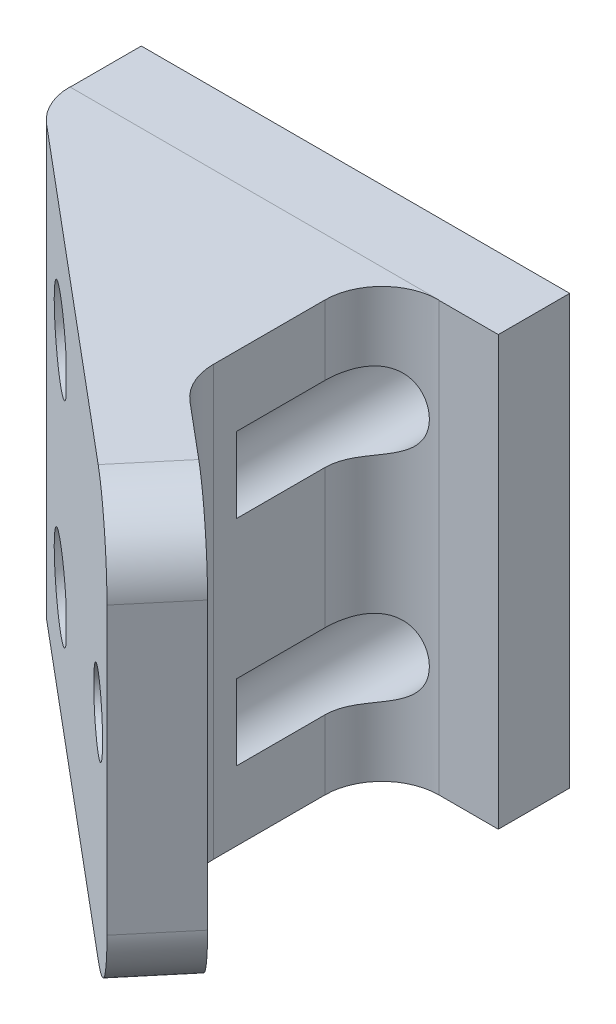
ISO-10303-21;
HEADER;
FILE_DESCRIPTION(('STEP AP214'),'2;1');
FILE_NAME('part.step','',(''),(''),'','','');
FILE_SCHEMA(('AUTOMOTIVE_DESIGN { 1 0 10303 214 1 1 1 1 }'));
ENDSEC;
DATA;
#1=APPLICATION_CONTEXT('core data for automotive mechanical design processes');
#2=APPLICATION_PROTOCOL_DEFINITION('international standard','automotive_design',2000,#1);
#3=PRODUCT_CONTEXT('',#1,'mechanical');
#4=PRODUCT('Part','Part','',(#3));
#5=PRODUCT_RELATED_PRODUCT_CATEGORY('part','',(#4));
#6=PRODUCT_DEFINITION_FORMATION('','',#4);
#7=PRODUCT_DEFINITION_CONTEXT('part definition',#1,'design');
#8=PRODUCT_DEFINITION('design','',#6,#7);
#9=PRODUCT_DEFINITION_SHAPE('','',#8);
#10=(LENGTH_UNIT() NAMED_UNIT(*) SI_UNIT(.MILLI.,.METRE.));
#11=(NAMED_UNIT(*) PLANE_ANGLE_UNIT() SI_UNIT($,.RADIAN.));
#12=(NAMED_UNIT(*) SI_UNIT($,.STERADIAN.) SOLID_ANGLE_UNIT());
#13=UNCERTAINTY_MEASURE_WITH_UNIT(LENGTH_MEASURE(1.E-05),#10,'distance_accuracy_value','');
#14=(GEOMETRIC_REPRESENTATION_CONTEXT(3) GLOBAL_UNCERTAINTY_ASSIGNED_CONTEXT((#13)) GLOBAL_UNIT_ASSIGNED_CONTEXT((#10,
#11,#12)) REPRESENTATION_CONTEXT('',''));
#15=CARTESIAN_POINT('',(0.,0.,0.));
#16=DIRECTION('',(0.,0.,1.));
#17=DIRECTION('',(1.,0.,0.));
#18=AXIS2_PLACEMENT_3D('',#15,#16,#17);
#19=CARTESIAN_POINT('',(0.,0.,3.175));
#20=DIRECTION('',(0.,0.,-1.));
#21=DIRECTION('',(-1.,0.,0.));
#22=AXIS2_PLACEMENT_3D('',#19,#20,#21);
#23=PLANE('',#22);
#24=DIRECTION('',(-1.,0.,0.));
#25=VECTOR('',#24,1.);
#26=CARTESIAN_POINT('',(-9.525,9.525,3.175));
#27=LINE('',#26,#25);
#28=CARTESIAN_POINT('',(9.525,9.525,3.175));
#29=VERTEX_POINT('',#28);
#30=CARTESIAN_POINT('',(6.88935843294051,9.525,3.175));
#31=VERTEX_POINT('',#30);
#32=EDGE_CURVE('E357',#29,#31,#27,.T.);
#33=ORIENTED_EDGE('',*,*,#32,.T.);
#34=DIRECTION('',(0.,1.,0.));
#35=VECTOR('',#34,1.);
#36=CARTESIAN_POINT('',(6.88935843294051,-9.525,3.175));
#37=LINE('',#36,#35);
#38=CARTESIAN_POINT('',(6.88935843294051,-9.525,3.175));
#39=VERTEX_POINT('',#38);
#40=EDGE_CURVE('E382',#39,#31,#37,.T.);
#41=ORIENTED_EDGE('',*,*,#40,.F.);
#42=DIRECTION('',(1.,0.,0.));
#43=VECTOR('',#42,1.);
#44=CARTESIAN_POINT('',(-9.525,-9.525,3.175));
#45=LINE('',#44,#43);
#46=CARTESIAN_POINT('',(9.525,-9.525,3.175));
#47=VERTEX_POINT('',#46);
#48=EDGE_CURVE('E335',#39,#47,#45,.T.);
#49=ORIENTED_EDGE('',*,*,#48,.T.);
#50=DIRECTION('',(0.,1.,0.));
#51=VECTOR('',#50,1.);
#52=CARTESIAN_POINT('',(9.525,-9.525,3.175));
#53=LINE('',#52,#51);
#54=EDGE_CURVE('E339',#47,#29,#53,.T.);
#55=ORIENTED_EDGE('',*,*,#54,.T.);
#56=EDGE_LOOP('',(#33,#41,#49,#55));
#57=FACE_BOUND('',#56,.T.);
#58=ADVANCED_FACE('F45',(#57),#23,.F.);
#59=CARTESIAN_POINT('',(0.,0.,0.));
#60=DIRECTION('',(0.,0.,-1.));
#61=DIRECTION('',(-1.,0.,0.));
#62=AXIS2_PLACEMENT_3D('',#59,#60,#61);
#63=PLANE('',#62);
#64=CARTESIAN_POINT('',(4.7625,-4.7625,0.));
#65=DIRECTION('',(0.,0.,1.));
#66=DIRECTION('',(1.,0.,0.));
#67=AXIS2_PLACEMENT_3D('',#64,#65,#66);
#68=CIRCLE('',#67,1.7272);
#69=CARTESIAN_POINT('',(6.4897,-4.7625,0.));
#70=VERTEX_POINT('',#69);
#71=EDGE_CURVE('E370',#70,#70,#68,.T.);
#72=ORIENTED_EDGE('',*,*,#71,.T.);
#73=EDGE_LOOP('',(#72));
#74=FACE_BOUND('',#73,.T.);
#75=CARTESIAN_POINT('',(-4.7625,4.7625,0.));
#76=DIRECTION('',(0.,0.,1.));
#77=DIRECTION('',(1.,0.,0.));
#78=AXIS2_PLACEMENT_3D('',#75,#76,#77);
#79=CIRCLE('',#78,1.7272);
#80=CARTESIAN_POINT('',(-3.0353,4.7625,0.));
#81=VERTEX_POINT('',#80);
#82=EDGE_CURVE('E350',#81,#81,#79,.T.);
#83=ORIENTED_EDGE('',*,*,#82,.T.);
#84=EDGE_LOOP('',(#83));
#85=FACE_BOUND('',#84,.T.);
#86=DIRECTION('',(0.,1.,0.));
#87=VECTOR('',#86,1.);
#88=CARTESIAN_POINT('',(9.525,-9.525,0.));
#89=LINE('',#88,#87);
#90=CARTESIAN_POINT('',(9.525,-9.525,0.));
#91=VERTEX_POINT('',#90);
#92=CARTESIAN_POINT('',(9.525,9.525,0.));
#93=VERTEX_POINT('',#92);
#94=EDGE_CURVE('E346',#91,#93,#89,.T.);
#95=ORIENTED_EDGE('',*,*,#94,.F.);
#96=DIRECTION('',(1.,0.,0.));
#97=VECTOR('',#96,1.);
#98=CARTESIAN_POINT('',(-9.525,-9.525,0.));
#99=LINE('',#98,#97);
#100=CARTESIAN_POINT('',(-9.525,-9.525,0.));
#101=VERTEX_POINT('',#100);
#102=EDGE_CURVE('E336',#101,#91,#99,.T.);
#103=ORIENTED_EDGE('',*,*,#102,.F.);
#104=DIRECTION('',(0.,-1.,0.));
#105=VECTOR('',#104,1.);
#106=CARTESIAN_POINT('',(-9.525,-9.525,0.));
#107=LINE('',#106,#105);
#108=CARTESIAN_POINT('',(-9.525,9.525,0.));
#109=VERTEX_POINT('',#108);
#110=EDGE_CURVE('E340',#109,#101,#107,.T.);
#111=ORIENTED_EDGE('',*,*,#110,.F.);
#112=DIRECTION('',(-1.,0.,0.));
#113=VECTOR('',#112,1.);
#114=CARTESIAN_POINT('',(-9.525,9.525,0.));
#115=LINE('',#114,#113);
#116=EDGE_CURVE('E343',#93,#109,#115,.T.);
#117=ORIENTED_EDGE('',*,*,#116,.F.);
#118=EDGE_LOOP('',(#95,#103,#111,#117));
#119=FACE_BOUND('',#118,.T.);
#120=CARTESIAN_POINT('',(4.7625,4.7625,0.));
#121=DIRECTION('',(0.,0.,1.));
#122=DIRECTION('',(1.,0.,0.));
#123=AXIS2_PLACEMENT_3D('',#120,#121,#122);
#124=CIRCLE('',#123,1.7272);
#125=CARTESIAN_POINT('',(6.4897,4.7625,0.));
#126=VERTEX_POINT('',#125);
#127=EDGE_CURVE('E366',#126,#126,#124,.T.);
#128=ORIENTED_EDGE('',*,*,#127,.T.);
#129=EDGE_LOOP('',(#128));
#130=FACE_BOUND('',#129,.T.);
#131=CARTESIAN_POINT('',(-4.7625,-4.7625,0.));
#132=DIRECTION('',(0.,0.,1.));
#133=DIRECTION('',(1.,0.,0.));
#134=AXIS2_PLACEMENT_3D('',#131,#132,#133);
#135=CIRCLE('',#134,1.7272);
#136=CARTESIAN_POINT('',(-3.0353,-4.7625,0.));
#137=VERTEX_POINT('',#136);
#138=EDGE_CURVE('E374',#137,#137,#135,.T.);
#139=ORIENTED_EDGE('',*,*,#138,.T.);
#140=EDGE_LOOP('',(#139));
#141=FACE_BOUND('',#140,.T.);
#142=ADVANCED_FACE('F247',(#74,#85,#119,#130,#141),#63,.T.);
#143=CARTESIAN_POINT('',(9.525,-9.525,3.175));
#144=DIRECTION('',(-1.,0.,0.));
#145=DIRECTION('',(0.,0.,1.));
#146=AXIS2_PLACEMENT_3D('',#143,#144,#145);
#147=PLANE('',#146);
#148=ORIENTED_EDGE('',*,*,#94,.T.);
#149=DIRECTION('',(0.,0.,-1.));
#150=VECTOR('',#149,1.);
#151=CARTESIAN_POINT('',(9.525,9.525,3.175));
#152=LINE('',#151,#150);
#153=EDGE_CURVE('E319',#29,#93,#152,.T.);
#154=ORIENTED_EDGE('',*,*,#153,.F.);
#155=ORIENTED_EDGE('',*,*,#54,.F.);
#156=DIRECTION('',(0.,0.,-1.));
#157=VECTOR('',#156,1.);
#158=CARTESIAN_POINT('',(9.525,-9.525,3.175));
#159=LINE('',#158,#157);
#160=EDGE_CURVE('E331',#47,#91,#159,.T.);
#161=ORIENTED_EDGE('',*,*,#160,.T.);
#162=EDGE_LOOP('',(#148,#154,#155,#161));
#163=FACE_BOUND('',#162,.T.);
#164=ADVANCED_FACE('F255',(#163),#147,.F.);
#165=CARTESIAN_POINT('',(-9.525,9.525,3.175));
#166=DIRECTION('',(0.,-1.,0.));
#167=DIRECTION('',(0.,0.,-1.));
#168=AXIS2_PLACEMENT_3D('',#165,#166,#167);
#169=PLANE('',#168);
#170=ORIENTED_EDGE('',*,*,#116,.T.);
#171=DIRECTION('',(0.,0.,-1.));
#172=VECTOR('',#171,1.);
#173=CARTESIAN_POINT('',(-9.525,9.525,3.175));
#174=LINE('',#173,#172);
#175=CARTESIAN_POINT('',(-9.525,9.525,3.175));
#176=VERTEX_POINT('',#175);
#177=EDGE_CURVE('E323',#176,#109,#174,.T.);
#178=ORIENTED_EDGE('',*,*,#177,.F.);
#179=DIRECTION('',(1.,0.,0.));
#180=VECTOR('',#179,1.);
#181=CARTESIAN_POINT('',(-9.525,9.525,3.175));
#182=LINE('',#181,#180);
#183=EDGE_CURVE('E378',#176,#31,#182,.T.);
#184=ORIENTED_EDGE('',*,*,#183,.T.);
#185=ORIENTED_EDGE('',*,*,#32,.F.);
#186=ORIENTED_EDGE('',*,*,#153,.T.);
#187=EDGE_LOOP('',(#170,#178,#184,#185,#186));
#188=FACE_BOUND('',#187,.T.);
#189=ADVANCED_FACE('F269',(#188),#169,.F.);
#190=CARTESIAN_POINT('',(-9.525,-9.525,3.175));
#191=DIRECTION('',(1.,0.,0.));
#192=DIRECTION('',(0.,0.,-1.));
#193=AXIS2_PLACEMENT_3D('',#190,#191,#192);
#194=PLANE('',#193);
#195=ORIENTED_EDGE('',*,*,#110,.T.);
#196=DIRECTION('',(0.,0.,-1.));
#197=VECTOR('',#196,1.);
#198=CARTESIAN_POINT('',(-9.525,-9.525,3.175));
#199=LINE('',#198,#197);
#200=CARTESIAN_POINT('',(-9.525,-9.525,3.175));
#201=VERTEX_POINT('',#200);
#202=EDGE_CURVE('E327',#201,#101,#199,.T.);
#203=ORIENTED_EDGE('',*,*,#202,.F.);
#204=DIRECTION('',(0.,-1.,0.));
#205=VECTOR('',#204,1.);
#206=CARTESIAN_POINT('',(-9.525,-9.525,3.175));
#207=LINE('',#206,#205);
#208=EDGE_CURVE('E353',#176,#201,#207,.T.);
#209=ORIENTED_EDGE('',*,*,#208,.F.);
#210=ORIENTED_EDGE('',*,*,#177,.T.);
#211=EDGE_LOOP('',(#195,#203,#209,#210));
#212=FACE_BOUND('',#211,.T.);
#213=ADVANCED_FACE('F265',(#212),#194,.F.);
#214=CARTESIAN_POINT('',(-9.525,-9.525,3.175));
#215=DIRECTION('',(0.,1.,0.));
#216=DIRECTION('',(0.,0.,1.));
#217=AXIS2_PLACEMENT_3D('',#214,#215,#216);
#218=PLANE('',#217);
#219=DIRECTION('',(-0.766044443118982,0.,-0.642787609686534));
#220=VECTOR('',#219,1.);
#221=CARTESIAN_POINT('',(10.1210601181422,-9.525,16.6997551073034));
#222=LINE('',#221,#220);
#223=CARTESIAN_POINT('',(7.68886901123948,-9.525,14.6589044465486));
#224=VERTEX_POINT('',#223);
#225=CARTESIAN_POINT('',(5.25667790433671,-9.525,12.6180537857939));
#226=VERTEX_POINT('',#225);
#227=EDGE_CURVE('E420',#224,#226,#222,.T.);
#228=ORIENTED_EDGE('',*,*,#227,.F.);
#229=DIRECTION('',(0.642787609686534,0.,-0.766044443118982));
#230=VECTOR('',#229,1.);
#231=CARTESIAN_POINT('',(5.64801835048473,-9.525,17.0910955534514));
#232=LINE('',#231,#230);
#233=CARTESIAN_POINT('',(5.64801835048473,-9.525,17.0910955534514));
#234=VERTEX_POINT('',#233);
#235=EDGE_CURVE('E291',#224,#234,#232,.F.);
#236=ORIENTED_EDGE('',*,*,#235,.T.);
#237=DIRECTION('',(0.766044443118982,0.,0.642787609686535));
#238=VECTOR('',#237,1.);
#239=CARTESIAN_POINT('',(-8.6176805286038,-9.525,5.12075288552222));
#240=LINE('',#239,#238);
#241=CARTESIAN_POINT('',(-8.6176805286038,-9.525,5.12075288552222));
#242=VERTEX_POINT('',#241);
#243=EDGE_CURVE('E423',#242,#234,#240,.T.);
#244=ORIENTED_EDGE('',*,*,#243,.F.);
#245=CARTESIAN_POINT('',(-6.985,-9.525,3.175));
#246=DIRECTION('',(0.,1.,0.));
#247=DIRECTION('',(0.,0.,-1.));
#248=AXIS2_PLACEMENT_3D('',#245,#246,#247);
#249=CIRCLE('',#248,2.54);
#250=EDGE_CURVE('E426',#201,#242,#249,.T.);
#251=ORIENTED_EDGE('',*,*,#250,.F.);
#252=ORIENTED_EDGE('',*,*,#202,.T.);
#253=ORIENTED_EDGE('',*,*,#102,.T.);
#254=ORIENTED_EDGE('',*,*,#160,.F.);
#255=ORIENTED_EDGE('',*,*,#48,.F.);
#256=CARTESIAN_POINT('',(6.88935843294051,-9.525,5.715));
#257=DIRECTION('',(0.,-1.,0.));
#258=DIRECTION('',(0.,0.,1.));
#259=AXIS2_PLACEMENT_3D('',#256,#257,#258);
#260=CIRCLE('',#259,2.54);
#261=CARTESIAN_POINT('',(4.34935843294051,-9.525,5.715));
#262=VERTEX_POINT('',#261);
#263=EDGE_CURVE('E430',#262,#39,#260,.T.);
#264=ORIENTED_EDGE('',*,*,#263,.F.);
#265=DIRECTION('',(0.,0.,-1.));
#266=VECTOR('',#265,1.);
#267=CARTESIAN_POINT('',(4.34935843294051,-9.525,10.6723009002717));
#268=LINE('',#267,#266);
#269=CARTESIAN_POINT('',(4.34935843294051,-9.525,10.6723009002717));
#270=VERTEX_POINT('',#269);
#271=EDGE_CURVE('E412',#270,#262,#268,.T.);
#272=ORIENTED_EDGE('',*,*,#271,.F.);
#273=CARTESIAN_POINT('',(6.88935843294051,-9.525,10.6723009002717));
#274=DIRECTION('',(0.,-1.,0.));
#275=DIRECTION('',(0.,0.,1.));
#276=AXIS2_PLACEMENT_3D('',#273,#274,#275);
#277=CIRCLE('',#276,2.54);
#278=EDGE_CURVE('E416',#226,#270,#277,.T.);
#279=ORIENTED_EDGE('',*,*,#278,.F.);
#280=EDGE_LOOP('',(#228,#236,#244,#251,#252,#253,#254,#255,#264,#272,#279));
#281=FACE_BOUND('',#280,.T.);
#282=ADVANCED_FACE('F262',(#281),#218,.F.);
#283=CARTESIAN_POINT('',(-4.7625,4.7625,3.175));
#284=DIRECTION('',(0.,0.,-1.));
#285=DIRECTION('',(-1.,0.,0.));
#286=AXIS2_PLACEMENT_3D('',#283,#284,#285);
#287=CYLINDRICAL_SURFACE('',#286,1.7272);
#288=ORIENTED_EDGE('',*,*,#82,.F.);
#289=EDGE_LOOP('',(#288));
#290=FACE_BOUND('',#289,.T.);
#291=CARTESIAN_POINT('',(-4.7625,4.7625,8.35563344519545));
#292=DIRECTION('',(-0.642787609686535,0.,0.766044443118982));
#293=DIRECTION('',(-0.766044443118982,0.,-0.642787609686535));
#294=AXIS2_PLACEMENT_3D('',#291,#292,#293);
#295=ELLIPSE('',#294,2.2546994701347,1.7272);
#296=CARTESIAN_POINT('',(-3.21755050099268,5.53473758359526,9.652));
#297=VERTEX_POINT('',#296);
#298=CARTESIAN_POINT('',(-3.21755050099268,3.99026241640474,9.652));
#299=VERTEX_POINT('',#298);
#300=EDGE_CURVE('E189',#297,#299,#295,.T.);
#301=ORIENTED_EDGE('',*,*,#300,.T.);
#302=CARTESIAN_POINT('',(-4.7625,4.7625,9.652));
#303=DIRECTION('',(0.,0.,-1.));
#304=DIRECTION('',(-1.,0.,0.));
#305=AXIS2_PLACEMENT_3D('',#302,#303,#304);
#306=CIRCLE('',#305,1.7272);
#307=EDGE_CURVE('E184',#297,#299,#306,.T.);
#308=ORIENTED_EDGE('',*,*,#307,.F.);
#309=EDGE_LOOP('',(#301,#308));
#310=FACE_BOUND('',#309,.T.);
#311=ADVANCED_FACE('F193',(#290,#310),#287,.F.);
#312=CARTESIAN_POINT('',(4.7625,4.7625,3.175));
#313=DIRECTION('',(0.,0.,-1.));
#314=DIRECTION('',(-1.,0.,0.));
#315=AXIS2_PLACEMENT_3D('',#312,#313,#314);
#316=CYLINDRICAL_SURFACE('',#315,1.7272);
#317=ORIENTED_EDGE('',*,*,#127,.F.);
#318=EDGE_LOOP('',(#317));
#319=FACE_BOUND('',#318,.T.);
#320=DIRECTION('',(0.,0.,-1.));
#321=VECTOR('',#320,1.);
#322=CARTESIAN_POINT('',(4.34935843294051,3.08543891418123,9.652));
#323=LINE('',#322,#321);
#324=CARTESIAN_POINT('',(4.34935843294051,3.08543891418123,9.652));
#325=VERTEX_POINT('',#324);
#326=CARTESIAN_POINT('',(4.34935843294051,3.08543891418123,5.715));
#327=VERTEX_POINT('',#326);
#328=EDGE_CURVE('E11',#325,#327,#323,.T.);
#329=ORIENTED_EDGE('',*,*,#328,.T.);
#330=CARTESIAN_POINT('',(4.34935843294051,3.08543891418123,5.715));
#331=CARTESIAN_POINT('',(4.34934998433347,3.08548039856214,5.64156751560622));
#332=CARTESIAN_POINT('',(4.35254283633185,3.08465529331753,5.5681462973115));
#333=CARTESIAN_POINT('',(4.36526047323366,3.08157814119282,5.42190599827185));
#334=CARTESIAN_POINT('',(4.37478330811569,3.07932653377253,5.34908673907901));
#335=CARTESIAN_POINT('',(4.40011623347238,3.07369650531227,5.20443610387347));
#336=CARTESIAN_POINT('',(4.41593915862802,3.07031578630184,5.13260705612648));
#337=CARTESIAN_POINT('',(4.45372466239388,3.06301591340464,4.99064193345755));
#338=CARTESIAN_POINT('',(4.47568734492603,3.05909675040472,4.92050588721328));
#339=CARTESIAN_POINT('',(4.54870399470318,3.04788612652279,4.71859379653202));
#340=CARTESIAN_POINT('',(4.6079125280005,3.04081617087523,4.58959220970845));
#341=CARTESIAN_POINT('',(4.71209732779733,3.03569079909071,4.40498347785171));
#342=CARTESIAN_POINT('',(4.7493635625111,3.03489456581964,4.3449592367221));
#343=CARTESIAN_POINT('',(4.82874691159049,3.03611373809574,4.2282408145803));
#344=CARTESIAN_POINT('',(4.87086225525507,3.03812812028696,4.17154542935007));
#345=CARTESIAN_POINT('',(4.97981718013454,3.04779829416812,4.03697233952981));
#346=CARTESIAN_POINT('',(5.04916825651825,3.05760922195755,3.96123668373125));
#347=CARTESIAN_POINT('',(5.19522749238245,3.0887299207983,3.81979437566224));
#348=CARTESIAN_POINT('',(5.27192861056503,3.11002877527417,3.75407827807684));
#349=CARTESIAN_POINT('',(5.39011519438907,3.15280876788497,3.66405362659932));
#350=CARTESIAN_POINT('',(5.43024412348904,3.16898374828264,3.63534728513557));
#351=CARTESIAN_POINT('',(5.51085360417635,3.20521530754559,3.58106545041732));
#352=CARTESIAN_POINT('',(5.55133396786565,3.22526992113637,3.55548838265549));
#353=CARTESIAN_POINT('',(5.63199208223658,3.26941094182688,3.50755083061537));
#354=CARTESIAN_POINT('',(5.67216989535682,3.29349649181294,3.48518966440291));
#355=CARTESIAN_POINT('',(5.75152287495129,3.34570290473432,3.44367031233488));
#356=CARTESIAN_POINT('',(5.79069817644041,3.37382322087474,3.42451169322789));
#357=CARTESIAN_POINT('',(5.89500973245156,3.45573094621517,3.37659833939501));
#358=CARTESIAN_POINT('',(5.9585365360534,3.51342456594835,3.35086201115095));
#359=CARTESIAN_POINT('',(6.07741453583632,3.63923395831975,3.30743311617445));
#360=CARTESIAN_POINT('',(6.13276502010788,3.70735063744045,3.28974124959234));
#361=CARTESIAN_POINT('',(6.23196535934992,3.85071937487169,3.26101259649727));
#362=CARTESIAN_POINT('',(6.27601695212987,3.92580793737524,3.24985370620059));
#363=CARTESIAN_POINT('',(6.35246193122505,4.08218903596723,3.23208075361513));
#364=CARTESIAN_POINT('',(6.38485336272073,4.16348260955605,3.22546745322311));
#365=CARTESIAN_POINT('',(6.438503343607,4.33499549441901,3.21517485963099));
#366=CARTESIAN_POINT('',(6.45901787635481,4.42545934658573,3.21168533675749));
#367=CARTESIAN_POINT('',(6.48531371551328,4.60857138043977,3.20730665882065));
#368=CARTESIAN_POINT('',(6.49109188033384,4.70122002364632,3.20641805823205));
#369=CARTESIAN_POINT('',(6.4876890093811,4.88924504725862,3.20695930812419));
#370=CARTESIAN_POINT('',(6.47801835744288,4.9846127879218,3.20846503450569));
#371=CARTESIAN_POINT('',(6.44307916379958,5.17236900478324,3.21445107747936));
#372=CARTESIAN_POINT('',(6.41780849946229,5.26475707374894,3.21893179887365));
#373=CARTESIAN_POINT('',(6.35250566758944,5.44380336953826,3.23216028847485));
#374=CARTESIAN_POINT('',(6.31248089562357,5.53046444142669,3.24090591958261));
#375=CARTESIAN_POINT('',(6.21916700768079,5.69540232410952,3.2645414072376));
#376=CARTESIAN_POINT('',(6.16588306384147,5.77368238717818,3.27942886946569));
#377=CARTESIAN_POINT('',(6.05061547890635,5.91666446140073,3.31674447304121));
#378=CARTESIAN_POINT('',(5.98902575400314,5.98176112898195,3.33887385619125));
#379=CARTESIAN_POINT('',(5.85884617056953,6.10002306041571,3.39237760441885));
#380=CARTESIAN_POINT('',(5.79026037335408,6.15319518992109,3.42374662550251));
#381=CARTESIAN_POINT('',(5.65367934195427,6.24418529204002,3.4945757780738));
#382=CARTESIAN_POINT('',(5.58585660516467,6.2826834699683,3.53350015676149));
#383=CARTESIAN_POINT('',(5.4505424936161,6.34852839123449,3.62027566009057));
#384=CARTESIAN_POINT('',(5.38305118123648,6.37587310922755,3.66812840372691));
#385=CARTESIAN_POINT('',(5.2489659925606,6.4213430407925,3.7738032422258));
#386=CARTESIAN_POINT('',(5.18248094521082,6.43912258303067,3.83190933935291));
#387=CARTESIAN_POINT('',(5.05510481620238,6.46598110052718,3.95573008862888));
#388=CARTESIAN_POINT('',(4.99421774266443,6.47505388498722,4.02145011738404));
#389=CARTESIAN_POINT('',(4.85327620848601,6.48936188037851,4.1908575932859));
#390=CARTESIAN_POINT('',(4.77718661609502,6.49094576583344,4.29816564395735));
#391=CARTESIAN_POINT('',(4.64247301600556,6.4868477186184,4.523190952507));
#392=CARTESIAN_POINT('',(4.58388626945777,6.48115041939642,4.64092973525224));
#393=CARTESIAN_POINT('',(4.48481161486518,6.46797995844679,4.88588240300696));
#394=CARTESIAN_POINT('',(4.4446153098335,6.46048088113119,5.0132139834768));
#395=CARTESIAN_POINT('',(4.39966960974953,6.45122465143059,5.2075762395521));
#396=CARTESIAN_POINT('',(4.38724920355354,6.44847254816623,5.27287716254418));
#397=CARTESIAN_POINT('',(4.36756256634933,6.44397298899695,5.40427650798773));
#398=CARTESIAN_POINT('',(4.36029361643844,6.44222500321826,5.47037449099272));
#399=CARTESIAN_POINT('',(4.35353779626924,6.44058610054929,5.56633597163947));
#400=CARTESIAN_POINT('',(4.35197010360249,6.44020270212031,5.59605945988579));
#401=CARTESIAN_POINT('',(4.34988096009452,6.4396900226349,5.65552073095325));
#402=CARTESIAN_POINT('',(4.34935864439809,6.43956053151914,5.68525848158232));
#403=CARTESIAN_POINT('',(4.34935843294051,6.43956108581877,5.715));
#404=B_SPLINE_CURVE_WITH_KNOTS('',3,(#330,#331,#332,#333,#334,#335,#336,#337,#338,#339,#340,
#341,#342,#343,#344,#345,#346,#347,#348,#349,#350,#351,#352,#353,#354,#355,#356,#357,#358,#359,
#360,#361,#362,#363,#364,#365,#366,#367,#368,#369,#370,#371,#372,#373,#374,#375,#376,#377,#378,
#379,#380,#381,#382,#383,#384,#385,#386,#387,#388,#389,#390,#391,#392,#393,#394,#395,#396,#397,
#398,#399,#400,#401,#402,#403),.UNSPECIFIED.,.F.,.F.,(4,2,2,2,2,2,2,2,2,2,2,2,2,2,2,2,2,2,2,2,2,
2,2,2,2,2,2,2,2,2,2,2,2,2,2,2,4),(0.,0.220204302265668,0.440340799574019,0.660928077352416,
0.881519089031494,1.30544613724147,1.51718330641857,1.72884340138926,2.03710486026993,
2.34507390381764,2.50063917572164,2.65612584955839,2.81157950356837,2.96701211023232,
3.23431974234748,3.50165063515187,3.76381081464865,4.02601492470759,4.3032389503431,
4.58052207137323,4.86676877381564,5.1530544333062,5.43919678539115,5.72522769356489,
6.00069624084933,6.27600577527627,6.53627236360476,6.79658619244614,7.06576473306695,
7.33513452720526,7.72766654098778,8.12102834230208,8.52042788126171,8.71984613340388,
8.91915905544051,9.0084451386631,9.09765732365582),.UNSPECIFIED.);
#405=CARTESIAN_POINT('',(4.34935843294051,6.43956108581877,5.715));
#406=VERTEX_POINT('',#405);
#407=EDGE_CURVE('E230',#327,#406,#404,.T.);
#408=ORIENTED_EDGE('',*,*,#407,.T.);
#409=DIRECTION('',(0.,0.,-1.));
#410=VECTOR('',#409,1.);
#411=CARTESIAN_POINT('',(4.34935843294051,6.43956108581877,9.652));
#412=LINE('',#411,#410);
#413=CARTESIAN_POINT('',(4.34935843294051,6.43956108581877,9.652));
#414=VERTEX_POINT('',#413);
#415=EDGE_CURVE('E54',#406,#414,#412,.F.);
#416=ORIENTED_EDGE('',*,*,#415,.T.);
#417=CARTESIAN_POINT('',(4.7625,4.7625,9.652));
#418=DIRECTION('',(0.,0.,-1.));
#419=DIRECTION('',(-1.,0.,0.));
#420=AXIS2_PLACEMENT_3D('',#417,#418,#419);
#421=CIRCLE('',#420,1.7272);
#422=EDGE_CURVE('E60',#325,#414,#421,.T.);
#423=ORIENTED_EDGE('',*,*,#422,.F.);
#424=EDGE_LOOP('',(#329,#408,#416,#423));
#425=FACE_BOUND('',#424,.T.);
#426=ADVANCED_FACE('F227',(#319,#425),#316,.F.);
#427=CARTESIAN_POINT('',(4.7625,-4.7625,3.175));
#428=DIRECTION('',(0.,0.,-1.));
#429=DIRECTION('',(-1.,0.,0.));
#430=AXIS2_PLACEMENT_3D('',#427,#428,#429);
#431=CYLINDRICAL_SURFACE('',#430,1.7272);
#432=ORIENTED_EDGE('',*,*,#71,.F.);
#433=EDGE_LOOP('',(#432));
#434=FACE_BOUND('',#433,.T.);
#435=DIRECTION('',(0.,0.,-1.));
#436=VECTOR('',#435,1.);
#437=CARTESIAN_POINT('',(4.34935843294051,-6.43956108581877,9.652));
#438=LINE('',#437,#436);
#439=CARTESIAN_POINT('',(4.34935843294051,-6.43956108581877,9.652));
#440=VERTEX_POINT('',#439);
#441=CARTESIAN_POINT('',(4.34935843294051,-6.43956108581877,5.715));
#442=VERTEX_POINT('',#441);
#443=EDGE_CURVE('E218',#440,#442,#438,.T.);
#444=ORIENTED_EDGE('',*,*,#443,.T.);
#445=CARTESIAN_POINT('',(4.34935843294051,-6.43956108581877,5.715));
#446=CARTESIAN_POINT('',(4.34934998433347,-6.43951960143786,5.64156751560622));
#447=CARTESIAN_POINT('',(4.35254283633185,-6.44034470668247,5.5681462973115));
#448=CARTESIAN_POINT('',(4.36526047323366,-6.44342185880718,5.42190599827185));
#449=CARTESIAN_POINT('',(4.37478330811569,-6.44567346622747,5.34908673907901));
#450=CARTESIAN_POINT('',(4.40011623347238,-6.45130349468774,5.20443610387347));
#451=CARTESIAN_POINT('',(4.41593915862802,-6.45468421369817,5.13260705612648));
#452=CARTESIAN_POINT('',(4.45372466239388,-6.46198408659536,4.99064193345754));
#453=CARTESIAN_POINT('',(4.47568734492603,-6.46590324959529,4.92050588721328));
#454=CARTESIAN_POINT('',(4.54870399470318,-6.47711387347722,4.71859379653201));
#455=CARTESIAN_POINT('',(4.6079125280005,-6.48418382912477,4.58959220970845));
#456=CARTESIAN_POINT('',(4.71209732779733,-6.4893092009093,4.40498347785171));
#457=CARTESIAN_POINT('',(4.7493635625111,-6.49010543418036,4.3449592367221));
#458=CARTESIAN_POINT('',(4.8287469115905,-6.48888626190426,4.2282408145803));
#459=CARTESIAN_POINT('',(4.87086225525507,-6.48687187971304,4.17154542935007));
#460=CARTESIAN_POINT('',(4.97981718013454,-6.47720170583188,4.03697233952981));
#461=CARTESIAN_POINT('',(5.04916825651825,-6.46739077804246,3.96123668373125));
#462=CARTESIAN_POINT('',(5.19522749238245,-6.43627007920171,3.81979437566224));
#463=CARTESIAN_POINT('',(5.27192861056503,-6.41497122472583,3.75407827807684));
#464=CARTESIAN_POINT('',(5.39011519438907,-6.37219123211503,3.66405362659932));
#465=CARTESIAN_POINT('',(5.43024412348904,-6.35601625171736,3.63534728513557));
#466=CARTESIAN_POINT('',(5.51085360417635,-6.31978469245441,3.58106545041732));
#467=CARTESIAN_POINT('',(5.55133396786565,-6.29973007886363,3.55548838265549));
#468=CARTESIAN_POINT('',(5.63199208223658,-6.25558905817312,3.50755083061537));
#469=CARTESIAN_POINT('',(5.67216989535682,-6.23150350818706,3.48518966440291));
#470=CARTESIAN_POINT('',(5.75152287495129,-6.17929709526568,3.44367031233488));
#471=CARTESIAN_POINT('',(5.79069817644042,-6.15117677912526,3.42451169322789));
#472=CARTESIAN_POINT('',(5.89500973245156,-6.06926905378483,3.37659833939501));
#473=CARTESIAN_POINT('',(5.9585365360534,-6.01157543405165,3.35086201115095));
#474=CARTESIAN_POINT('',(6.07741453583632,-5.88576604168025,3.30743311617444));
#475=CARTESIAN_POINT('',(6.13276502010789,-5.81764936255955,3.28974124959233));
#476=CARTESIAN_POINT('',(6.23196535934993,-5.6742806251283,3.26101259649726));
#477=CARTESIAN_POINT('',(6.27601695212987,-5.59919206262476,3.24985370620059));
#478=CARTESIAN_POINT('',(6.35246193122506,-5.44281096403276,3.23208075361513));
#479=CARTESIAN_POINT('',(6.38485336272073,-5.36151739044395,3.22546745322311));
#480=CARTESIAN_POINT('',(6.43850334360701,-5.19000450558099,3.21517485963099));
#481=CARTESIAN_POINT('',(6.45901787635481,-5.09954065341427,3.21168533675749));
#482=CARTESIAN_POINT('',(6.48531371551328,-4.91642861956023,3.20730665882065));
#483=CARTESIAN_POINT('',(6.49109188033385,-4.82377997635367,3.20641805823205));
#484=CARTESIAN_POINT('',(6.4876890093811,-4.63575495274138,3.20695930812419));
#485=CARTESIAN_POINT('',(6.47801835744288,-4.5403872120782,3.20846503450569));
#486=CARTESIAN_POINT('',(6.44307916379958,-4.35263099521675,3.21445107747936));
#487=CARTESIAN_POINT('',(6.41780849946229,-4.26024292625106,3.21893179887365));
#488=CARTESIAN_POINT('',(6.35250566758945,-4.08119663046174,3.23216028847485));
#489=CARTESIAN_POINT('',(6.31248089562357,-3.9945355585733,3.24090591958261));
#490=CARTESIAN_POINT('',(6.21916700768079,-3.82959767589047,3.2645414072376));
#491=CARTESIAN_POINT('',(6.16588306384147,-3.75131761282182,3.27942886946569));
#492=CARTESIAN_POINT('',(6.05061547890635,-3.60833553859927,3.31674447304121));
#493=CARTESIAN_POINT('',(5.98902575400314,-3.54323887101804,3.33887385619125));
#494=CARTESIAN_POINT('',(5.85884617056953,-3.42497693958428,3.39237760441885));
#495=CARTESIAN_POINT('',(5.79026037335408,-3.3718048100789,3.42374662550251));
#496=CARTESIAN_POINT('',(5.65367934195427,-3.28081470795997,3.4945757780738));
#497=CARTESIAN_POINT('',(5.58585660516467,-3.24231653003169,3.5335001567615));
#498=CARTESIAN_POINT('',(5.45054249361609,-3.17647160876551,3.62027566009057));
#499=CARTESIAN_POINT('',(5.38305118123647,-3.14912689077244,3.66812840372691));
#500=CARTESIAN_POINT('',(5.2489659925606,-3.10365695920749,3.7738032422258));
#501=CARTESIAN_POINT('',(5.18248094521082,-3.08587741696932,3.83190933935291));
#502=CARTESIAN_POINT('',(5.05510481620238,-3.05901889947281,3.95573008862888));
#503=CARTESIAN_POINT('',(4.99421774266443,-3.04994611501277,4.02145011738404));
#504=CARTESIAN_POINT('',(4.85327620848601,-3.03563811962149,4.1908575932859));
#505=CARTESIAN_POINT('',(4.77718661609502,-3.03405423416656,4.29816564395735));
#506=CARTESIAN_POINT('',(4.64247301600556,-3.03815228138159,4.523190952507));
#507=CARTESIAN_POINT('',(4.58388626945777,-3.04384958060358,4.64092973525224));
#508=CARTESIAN_POINT('',(4.48481161486518,-3.05702004155321,4.88588240300696));
#509=CARTESIAN_POINT('',(4.4446153098335,-3.0645191188688,5.01321398347681));
#510=CARTESIAN_POINT('',(4.39966960974953,-3.0737753485694,5.2075762395521));
#511=CARTESIAN_POINT('',(4.38724920355354,-3.07652745183377,5.27287716254418));
#512=CARTESIAN_POINT('',(4.36756256634933,-3.08102701100305,5.40427650798774));
#513=CARTESIAN_POINT('',(4.36029361643844,-3.08277499678174,5.47037449099272));
#514=CARTESIAN_POINT('',(4.35353779626924,-3.08441389945071,5.56633597163947));
#515=CARTESIAN_POINT('',(4.35197010360249,-3.08479729787969,5.5960594598858));
#516=CARTESIAN_POINT('',(4.34988096009452,-3.0853099773651,5.65552073095325));
#517=CARTESIAN_POINT('',(4.34935864439809,-3.08543946848086,5.68525848158232));
#518=CARTESIAN_POINT('',(4.34935843294051,-3.08543891418123,5.715));
#519=B_SPLINE_CURVE_WITH_KNOTS('',3,(#445,#446,#447,#448,#449,#450,#451,#452,#453,#454,#455,
#456,#457,#458,#459,#460,#461,#462,#463,#464,#465,#466,#467,#468,#469,#470,#471,#472,#473,#474,
#475,#476,#477,#478,#479,#480,#481,#482,#483,#484,#485,#486,#487,#488,#489,#490,#491,#492,#493,
#494,#495,#496,#497,#498,#499,#500,#501,#502,#503,#504,#505,#506,#507,#508,#509,#510,#511,#512,
#513,#514,#515,#516,#517,#518),.UNSPECIFIED.,.F.,.F.,(4,2,2,2,2,2,2,2,2,2,2,2,2,2,2,2,2,2,2,2,2,
2,2,2,2,2,2,2,2,2,2,2,2,2,2,2,4),(0.,0.220204302265668,0.44034079957402,0.660928077352417,
0.881519089031495,1.30544613724147,1.51718330641857,1.72884340138926,2.03710486026993,
2.34507390381764,2.50063917572165,2.65612584955839,2.81157950356838,2.96701211023233,
3.23431974234748,3.50165063515188,3.76381081464866,4.0260149247076,4.3032389503431,
4.58052207137324,4.86676877381565,5.15305443330621,5.43919678539116,5.7252276935649,
6.00069624084934,6.27600577527628,6.53627236360477,6.79658619244615,7.06576473306697,
7.33513452720528,7.7276665409878,8.1210283423021,8.52042788126173,8.7198461334039,
8.91915905544053,9.00844513866311,9.09765732365583),.UNSPECIFIED.);
#520=CARTESIAN_POINT('',(4.34935843294051,-3.08543891418123,5.715));
#521=VERTEX_POINT('',#520);
#522=EDGE_CURVE('E476',#442,#521,#519,.T.);
#523=ORIENTED_EDGE('',*,*,#522,.T.);
#524=DIRECTION('',(0.,0.,-1.));
#525=VECTOR('',#524,1.);
#526=CARTESIAN_POINT('',(4.34935843294051,-3.08543891418123,9.652));
#527=LINE('',#526,#525);
#528=CARTESIAN_POINT('',(4.34935843294051,-3.08543891418123,9.652));
#529=VERTEX_POINT('',#528);
#530=EDGE_CURVE('E215',#521,#529,#527,.F.);
#531=ORIENTED_EDGE('',*,*,#530,.T.);
#532=CARTESIAN_POINT('',(4.7625,-4.7625,9.652));
#533=DIRECTION('',(0.,0.,-1.));
#534=DIRECTION('',(-1.,0.,0.));
#535=AXIS2_PLACEMENT_3D('',#532,#533,#534);
#536=CIRCLE('',#535,1.7272);
#537=EDGE_CURVE('E67',#440,#529,#536,.T.);
#538=ORIENTED_EDGE('',*,*,#537,.F.);
#539=EDGE_LOOP('',(#444,#523,#531,#538));
#540=FACE_BOUND('',#539,.T.);
#541=ADVANCED_FACE('F576',(#434,#540),#431,.F.);
#542=CARTESIAN_POINT('',(-4.7625,-4.7625,3.175));
#543=DIRECTION('',(0.,0.,-1.));
#544=DIRECTION('',(-1.,0.,0.));
#545=AXIS2_PLACEMENT_3D('',#542,#543,#544);
#546=CYLINDRICAL_SURFACE('',#545,1.7272);
#547=ORIENTED_EDGE('',*,*,#138,.F.);
#548=EDGE_LOOP('',(#547));
#549=FACE_BOUND('',#548,.T.);
#550=CARTESIAN_POINT('',(-4.7625,-4.7625,8.35563344519545));
#551=DIRECTION('',(-0.642787609686535,0.,0.766044443118982));
#552=DIRECTION('',(-0.766044443118982,0.,-0.642787609686535));
#553=AXIS2_PLACEMENT_3D('',#550,#551,#552);
#554=ELLIPSE('',#553,2.2546994701347,1.7272);
#555=CARTESIAN_POINT('',(-3.21755050099268,-3.99026241640474,9.652));
#556=VERTEX_POINT('',#555);
#557=CARTESIAN_POINT('',(-3.21755050099268,-5.53473758359526,9.652));
#558=VERTEX_POINT('',#557);
#559=EDGE_CURVE('E204',#556,#558,#554,.T.);
#560=ORIENTED_EDGE('',*,*,#559,.T.);
#561=CARTESIAN_POINT('',(-4.7625,-4.7625,9.652));
#562=DIRECTION('',(0.,0.,-1.));
#563=DIRECTION('',(-1.,0.,0.));
#564=AXIS2_PLACEMENT_3D('',#561,#562,#563);
#565=CIRCLE('',#564,1.7272);
#566=EDGE_CURVE('E195',#556,#558,#565,.T.);
#567=ORIENTED_EDGE('',*,*,#566,.F.);
#568=EDGE_LOOP('',(#560,#567));
#569=FACE_BOUND('',#568,.T.);
#570=ADVANCED_FACE('F573',(#549,#569),#546,.F.);
#571=CARTESIAN_POINT('',(6.88935843294051,-9.525,5.715));
#572=DIRECTION('',(0.,1.,0.));
#573=DIRECTION('',(0.,0.,1.));
#574=AXIS2_PLACEMENT_3D('',#571,#572,#573);
#575=CYLINDRICAL_SURFACE('',#574,2.54);
#576=ORIENTED_EDGE('',*,*,#407,.F.);
#577=DIRECTION('',(0.,1.,0.));
#578=VECTOR('',#577,1.);
#579=CARTESIAN_POINT('',(4.34935843294051,-9.525,5.715));
#580=LINE('',#579,#578);
#581=EDGE_CURVE('E411',#521,#327,#580,.T.);
#582=ORIENTED_EDGE('',*,*,#581,.F.);
#583=ORIENTED_EDGE('',*,*,#522,.F.);
#584=EDGE_CURVE('E381',#262,#442,#580,.T.);
#585=ORIENTED_EDGE('',*,*,#584,.F.);
#586=ORIENTED_EDGE('',*,*,#263,.T.);
#587=ORIENTED_EDGE('',*,*,#40,.T.);
#588=CARTESIAN_POINT('',(6.88935843294051,9.5377,3.175));
#589=VERTEX_POINT('',#588);
#590=EDGE_CURVE('E387',#31,#589,#37,.T.);
#591=ORIENTED_EDGE('',*,*,#590,.T.);
#592=CARTESIAN_POINT('',(6.88935843294051,9.5377,5.715));
#593=DIRECTION('',(0.,-1.,0.));
#594=DIRECTION('',(0.,0.,1.));
#595=AXIS2_PLACEMENT_3D('',#592,#593,#594);
#596=CIRCLE('',#595,2.54);
#597=CARTESIAN_POINT('',(4.34935843294051,9.5377,5.715));
#598=VERTEX_POINT('',#597);
#599=EDGE_CURVE('E457',#598,#589,#596,.T.);
#600=ORIENTED_EDGE('',*,*,#599,.F.);
#601=EDGE_CURVE('E407',#406,#598,#580,.T.);
#602=ORIENTED_EDGE('',*,*,#601,.F.);
#603=EDGE_LOOP('',(#576,#582,#583,#585,#586,#587,#591,#600,#602));
#604=FACE_BOUND('',#603,.T.);
#605=ADVANCED_FACE('F483',(#604),#575,.F.);
#606=CARTESIAN_POINT('',(4.34935843294051,-9.525,10.6723009002717));
#607=DIRECTION('',(1.,0.,0.));
#608=DIRECTION('',(0.,0.,-1.));
#609=AXIS2_PLACEMENT_3D('',#606,#607,#608);
#610=PLANE('',#609);
#611=ORIENTED_EDGE('',*,*,#328,.F.);
#612=DIRECTION('',(0.,1.,0.));
#613=VECTOR('',#612,1.);
#614=CARTESIAN_POINT('',(4.34935843294051,-9.525,9.652));
#615=LINE('',#614,#613);
#616=EDGE_CURVE('E221',#325,#414,#615,.T.);
#617=ORIENTED_EDGE('',*,*,#616,.T.);
#618=ORIENTED_EDGE('',*,*,#415,.F.);
#619=ORIENTED_EDGE('',*,*,#601,.T.);
#620=DIRECTION('',(0.,0.,-1.));
#621=VECTOR('',#620,1.);
#622=CARTESIAN_POINT('',(4.34935843294051,9.5377,10.6723009002717));
#623=LINE('',#622,#621);
#624=CARTESIAN_POINT('',(4.34935843294051,9.5377,10.6723009002717));
#625=VERTEX_POINT('',#624);
#626=EDGE_CURVE('E434',#625,#598,#623,.T.);
#627=ORIENTED_EDGE('',*,*,#626,.F.);
#628=DIRECTION('',(0.,1.,0.));
#629=VECTOR('',#628,1.);
#630=CARTESIAN_POINT('',(4.34935843294051,-9.525,10.6723009002717));
#631=LINE('',#630,#629);
#632=EDGE_CURVE('E404',#270,#625,#631,.T.);
#633=ORIENTED_EDGE('',*,*,#632,.F.);
#634=ORIENTED_EDGE('',*,*,#271,.T.);
#635=ORIENTED_EDGE('',*,*,#584,.T.);
#636=ORIENTED_EDGE('',*,*,#443,.F.);
#637=DIRECTION('',(0.,1.,0.));
#638=VECTOR('',#637,1.);
#639=CARTESIAN_POINT('',(4.34935843294051,-9.525,9.652));
#640=LINE('',#639,#638);
#641=EDGE_CURVE('E211',#440,#529,#640,.T.);
#642=ORIENTED_EDGE('',*,*,#641,.T.);
#643=ORIENTED_EDGE('',*,*,#530,.F.);
#644=ORIENTED_EDGE('',*,*,#581,.T.);
#645=EDGE_LOOP('',(#611,#617,#618,#619,#627,#633,#634,#635,#636,#642,#643,#644));
#646=FACE_BOUND('',#645,.T.);
#647=ADVANCED_FACE('F233',(#646),#610,.T.);
#648=CARTESIAN_POINT('',(6.88935843294051,-9.525,10.6723009002717));
#649=DIRECTION('',(0.,1.,0.));
#650=DIRECTION('',(0.,0.,1.));
#651=AXIS2_PLACEMENT_3D('',#648,#649,#650);
#652=CYLINDRICAL_SURFACE('',#651,2.54);
#653=ORIENTED_EDGE('',*,*,#632,.T.);
#654=CARTESIAN_POINT('',(6.88935843294051,9.5377,10.6723009002717));
#655=DIRECTION('',(0.,-1.,0.));
#656=DIRECTION('',(0.,0.,1.));
#657=AXIS2_PLACEMENT_3D('',#654,#655,#656);
#658=CIRCLE('',#657,2.54);
#659=CARTESIAN_POINT('',(5.25667790433671,9.5377,12.6180537857939));
#660=VERTEX_POINT('',#659);
#661=EDGE_CURVE('E438',#660,#625,#658,.T.);
#662=ORIENTED_EDGE('',*,*,#661,.F.);
#663=DIRECTION('',(0.,1.,0.));
#664=VECTOR('',#663,1.);
#665=CARTESIAN_POINT('',(5.25667790433671,-9.525,12.6180537857939));
#666=LINE('',#665,#664);
#667=EDGE_CURVE('E400',#226,#660,#666,.T.);
#668=ORIENTED_EDGE('',*,*,#667,.F.);
#669=ORIENTED_EDGE('',*,*,#278,.T.);
#670=EDGE_LOOP('',(#653,#662,#668,#669));
#671=FACE_BOUND('',#670,.T.);
#672=ADVANCED_FACE('F508',(#671),#652,.F.);
#673=CARTESIAN_POINT('',(10.1210601181422,-9.525,16.6997551073034));
#674=DIRECTION('',(0.642787609686535,0.,-0.766044443118982));
#675=DIRECTION('',(-0.766044443118982,0.,-0.642787609686534));
#676=AXIS2_PLACEMENT_3D('',#673,#674,#675);
#677=PLANE('',#676);
#678=CARTESIAN_POINT('',(7.68886901123948,0.,14.6589044465486));
#679=DIRECTION('',(0.642787609686535,0.,-0.766044443118982));
#680=DIRECTION('',(-0.766044443118982,0.,-0.642787609686534));
#681=AXIS2_PLACEMENT_3D('',#678,#679,#680);
#682=CIRCLE('',#681,1.5875);
#683=CARTESIAN_POINT('',(6.47277345778809,0.,13.6384791161712));
#684=VERTEX_POINT('',#683);
#685=EDGE_CURVE('E462',#684,#684,#682,.F.);
#686=ORIENTED_EDGE('',*,*,#685,.T.);
#687=EDGE_LOOP('',(#686));
#688=FACE_BOUND('',#687,.T.);
#689=DIRECTION('',(0.,1.,0.));
#690=VECTOR('',#689,1.);
#691=CARTESIAN_POINT('',(10.1210601181422,-9.525,16.6997551073034));
#692=LINE('',#691,#690);
#693=CARTESIAN_POINT('',(10.1210601181422,-6.35,16.6997551073034));
#694=VERTEX_POINT('',#693);
#695=CARTESIAN_POINT('',(10.1210601181422,6.36269999999999,16.6997551073034));
#696=VERTEX_POINT('',#695);
#697=EDGE_CURVE('E396',#694,#696,#692,.T.);
#698=ORIENTED_EDGE('',*,*,#697,.F.);
#699=CARTESIAN_POINT('',(7.68886901123948,-6.35,14.6589044465486));
#700=DIRECTION('',(0.642787609686535,0.,-0.766044443118982));
#701=DIRECTION('',(-0.766044443118982,0.,-0.642787609686534));
#702=AXIS2_PLACEMENT_3D('',#699,#700,#701);
#703=CIRCLE('',#702,3.175);
#704=EDGE_CURVE('E308',#694,#224,#703,.T.);
#705=ORIENTED_EDGE('',*,*,#704,.T.);
#706=ORIENTED_EDGE('',*,*,#227,.T.);
#707=ORIENTED_EDGE('',*,*,#667,.T.);
#708=DIRECTION('',(-0.766044443118982,0.,-0.642787609686534));
#709=VECTOR('',#708,1.);
#710=CARTESIAN_POINT('',(10.1210601181422,9.5377,16.6997551073034));
#711=LINE('',#710,#709);
#712=CARTESIAN_POINT('',(7.68886901123948,9.5377,14.6589044465486));
#713=VERTEX_POINT('',#712);
#714=EDGE_CURVE('E442',#713,#660,#711,.T.);
#715=ORIENTED_EDGE('',*,*,#714,.F.);
#716=CARTESIAN_POINT('',(7.68886901123948,6.3627,14.6589044465486));
#717=DIRECTION('',(0.642787609686535,0.,-0.766044443118982));
#718=DIRECTION('',(-0.766044443118982,0.,-0.642787609686534));
#719=AXIS2_PLACEMENT_3D('',#716,#717,#718);
#720=CIRCLE('',#719,3.175);
#721=EDGE_CURVE('E311',#713,#696,#720,.T.);
#722=ORIENTED_EDGE('',*,*,#721,.T.);
#723=EDGE_LOOP('',(#698,#705,#706,#707,#715,#722));
#724=FACE_BOUND('',#723,.T.);
#725=ADVANCED_FACE('F511',(#688,#724),#677,.T.);
#726=CARTESIAN_POINT('',(8.08020945738749,-9.525,19.1319462142061));
#727=DIRECTION('',(0.766044443118982,0.,0.642787609686534));
#728=DIRECTION('',(0.642787609686534,0.,-0.766044443118982));
#729=AXIS2_PLACEMENT_3D('',#726,#727,#728);
#730=PLANE('',#729);
#731=DIRECTION('',(0.,1.,0.));
#732=VECTOR('',#731,1.);
#733=CARTESIAN_POINT('',(8.08020945738749,-9.525,19.1319462142061));
#734=LINE('',#733,#732);
#735=CARTESIAN_POINT('',(8.08020945738749,-6.35,19.1319462142061));
#736=VERTEX_POINT('',#735);
#737=CARTESIAN_POINT('',(8.08020945738749,6.36269999999999,19.1319462142061));
#738=VERTEX_POINT('',#737);
#739=EDGE_CURVE('E393',#736,#738,#734,.T.);
#740=ORIENTED_EDGE('',*,*,#739,.F.);
#741=DIRECTION('',(0.642787609686534,0.,-0.766044443118982));
#742=VECTOR('',#741,1.);
#743=CARTESIAN_POINT('',(10.1210601181422,-6.35,16.6997551073034));
#744=LINE('',#743,#742);
#745=EDGE_CURVE('E293',#736,#694,#744,.T.);
#746=ORIENTED_EDGE('',*,*,#745,.T.);
#747=ORIENTED_EDGE('',*,*,#697,.T.);
#748=DIRECTION('',(0.642787609686534,0.,-0.766044443118982));
#749=VECTOR('',#748,1.);
#750=CARTESIAN_POINT('',(8.08020945738749,6.3627,19.1319462142061));
#751=LINE('',#750,#749);
#752=EDGE_CURVE('E316',#696,#738,#751,.F.);
#753=ORIENTED_EDGE('',*,*,#752,.T.);
#754=EDGE_LOOP('',(#740,#746,#747,#753));
#755=FACE_BOUND('',#754,.T.);
#756=ADVANCED_FACE('F514',(#755),#730,.T.);
#757=CARTESIAN_POINT('',(-8.6176805286038,-9.525,5.12075288552222));
#758=DIRECTION('',(-0.642787609686535,0.,0.766044443118982));
#759=DIRECTION('',(0.766044443118982,0.,0.642787609686535));
#760=AXIS2_PLACEMENT_3D('',#757,#758,#759);
#761=PLANE('',#760);
#762=ORIENTED_EDGE('',*,*,#559,.F.);
#763=DIRECTION('',(0.,-1.,0.));
#764=VECTOR('',#763,1.);
#765=CARTESIAN_POINT('',(-3.21755050099268,-9.525,9.652));
#766=LINE('',#765,#764);
#767=EDGE_CURVE('E200',#556,#558,#766,.T.);
#768=ORIENTED_EDGE('',*,*,#767,.T.);
#769=EDGE_LOOP('',(#762,#768));
#770=FACE_BOUND('',#769,.T.);
#771=ORIENTED_EDGE('',*,*,#300,.F.);
#772=DIRECTION('',(0.,-1.,0.));
#773=VECTOR('',#772,1.);
#774=CARTESIAN_POINT('',(-3.21755050099268,-9.525,9.652));
#775=LINE('',#774,#773);
#776=EDGE_CURVE('E181',#297,#299,#775,.T.);
#777=ORIENTED_EDGE('',*,*,#776,.T.);
#778=EDGE_LOOP('',(#771,#777));
#779=FACE_BOUND('',#778,.T.);
#780=CARTESIAN_POINT('',(5.64801835048473,0.,17.0910955534514));
#781=DIRECTION('',(-0.642787609686535,0.,0.766044443118982));
#782=DIRECTION('',(0.766044443118982,0.,0.642787609686535));
#783=AXIS2_PLACEMENT_3D('',#780,#781,#782);
#784=CIRCLE('',#783,1.5875);
#785=CARTESIAN_POINT('',(6.86411390393611,0.,18.1115208838288));
#786=VERTEX_POINT('',#785);
#787=EDGE_CURVE('E461',#786,#786,#784,.T.);
#788=ORIENTED_EDGE('',*,*,#787,.F.);
#789=EDGE_LOOP('',(#788));
#790=FACE_BOUND('',#789,.T.);
#791=ORIENTED_EDGE('',*,*,#243,.T.);
#792=CARTESIAN_POINT('',(5.64801835048473,-6.35,17.0910955534514));
#793=DIRECTION('',(-0.642787609686535,0.,0.766044443118982));
#794=DIRECTION('',(0.766044443118982,0.,0.642787609686535));
#795=AXIS2_PLACEMENT_3D('',#792,#793,#794);
#796=CIRCLE('',#795,3.175);
#797=EDGE_CURVE('E290',#234,#736,#796,.T.);
#798=ORIENTED_EDGE('',*,*,#797,.T.);
#799=ORIENTED_EDGE('',*,*,#739,.T.);
#800=CARTESIAN_POINT('',(5.64801835048473,6.3627,17.0910955534514));
#801=DIRECTION('',(-0.642787609686535,0.,0.766044443118982));
#802=DIRECTION('',(0.766044443118982,0.,0.642787609686535));
#803=AXIS2_PLACEMENT_3D('',#800,#801,#802);
#804=CIRCLE('',#803,3.175);
#805=CARTESIAN_POINT('',(5.64801835048473,9.5377,17.0910955534514));
#806=VERTEX_POINT('',#805);
#807=EDGE_CURVE('E299',#738,#806,#804,.T.);
#808=ORIENTED_EDGE('',*,*,#807,.T.);
#809=DIRECTION('',(0.766044443118982,0.,0.642787609686535));
#810=VECTOR('',#809,1.);
#811=CARTESIAN_POINT('',(-8.6176805286038,9.5377,5.12075288552222));
#812=LINE('',#811,#810);
#813=CARTESIAN_POINT('',(-8.6176805286038,9.5377,5.12075288552222));
#814=VERTEX_POINT('',#813);
#815=EDGE_CURVE('E445',#814,#806,#812,.T.);
#816=ORIENTED_EDGE('',*,*,#815,.F.);
#817=DIRECTION('',(0.,1.,0.));
#818=VECTOR('',#817,1.);
#819=CARTESIAN_POINT('',(-8.6176805286038,-9.525,5.12075288552222));
#820=LINE('',#819,#818);
#821=EDGE_CURVE('E390',#242,#814,#820,.T.);
#822=ORIENTED_EDGE('',*,*,#821,.F.);
#823=EDGE_LOOP('',(#791,#798,#799,#808,#816,#822));
#824=FACE_BOUND('',#823,.T.);
#825=ADVANCED_FACE('F197',(#770,#779,#790,#824),#761,.T.);
#826=CARTESIAN_POINT('',(-6.985,-9.525,3.175));
#827=DIRECTION('',(0.,1.,0.));
#828=DIRECTION('',(0.,0.,1.));
#829=AXIS2_PLACEMENT_3D('',#826,#827,#828);
#830=CYLINDRICAL_SURFACE('',#829,2.54);
#831=ORIENTED_EDGE('',*,*,#821,.T.);
#832=CARTESIAN_POINT('',(-6.985,9.5377,3.175));
#833=DIRECTION('',(0.,1.,0.));
#834=DIRECTION('',(0.,0.,-1.));
#835=AXIS2_PLACEMENT_3D('',#832,#833,#834);
#836=CIRCLE('',#835,2.54);
#837=CARTESIAN_POINT('',(-9.525,9.5377,3.175));
#838=VERTEX_POINT('',#837);
#839=EDGE_CURVE('E449',#838,#814,#836,.T.);
#840=ORIENTED_EDGE('',*,*,#839,.F.);
#841=DIRECTION('',(0.,1.,0.));
#842=VECTOR('',#841,1.);
#843=CARTESIAN_POINT('',(-9.525,-9.525,3.175));
#844=LINE('',#843,#842);
#845=EDGE_CURVE('E386',#176,#838,#844,.T.);
#846=ORIENTED_EDGE('',*,*,#845,.F.);
#847=ORIENTED_EDGE('',*,*,#208,.T.);
#848=ORIENTED_EDGE('',*,*,#250,.T.);
#849=EDGE_LOOP('',(#831,#840,#846,#847,#848));
#850=FACE_BOUND('',#849,.T.);
#851=ADVANCED_FACE('F520',(#850),#830,.T.);
#852=CARTESIAN_POINT('',(-9.525,-9.525,3.175));
#853=DIRECTION('',(0.,0.,-1.));
#854=DIRECTION('',(-1.,0.,0.));
#855=AXIS2_PLACEMENT_3D('',#852,#853,#854);
#856=PLANE('',#855);
#857=ORIENTED_EDGE('',*,*,#183,.F.);
#858=ORIENTED_EDGE('',*,*,#845,.T.);
#859=DIRECTION('',(-1.,0.,0.));
#860=VECTOR('',#859,1.);
#861=CARTESIAN_POINT('',(-9.525,9.5377,3.175));
#862=LINE('',#861,#860);
#863=EDGE_CURVE('E453',#589,#838,#862,.T.);
#864=ORIENTED_EDGE('',*,*,#863,.F.);
#865=ORIENTED_EDGE('',*,*,#590,.F.);
#866=EDGE_LOOP('',(#857,#858,#864,#865));
#867=FACE_BOUND('',#866,.T.);
#868=ADVANCED_FACE('F284',(#867),#856,.T.);
#869=CARTESIAN_POINT('',(6.88935843294051,9.5377,5.715));
#870=DIRECTION('',(0.,1.,0.));
#871=DIRECTION('',(0.,0.,1.));
#872=AXIS2_PLACEMENT_3D('',#869,#870,#871);
#873=PLANE('',#872);
#874=ORIENTED_EDGE('',*,*,#815,.T.);
#875=DIRECTION('',(0.642787609686534,0.,-0.766044443118982));
#876=VECTOR('',#875,1.);
#877=CARTESIAN_POINT('',(11.7625437201442,9.5377,9.80408797715114));
#878=LINE('',#877,#876);
#879=EDGE_CURVE('E190',#806,#713,#878,.T.);
#880=ORIENTED_EDGE('',*,*,#879,.T.);
#881=ORIENTED_EDGE('',*,*,#714,.T.);
#882=ORIENTED_EDGE('',*,*,#661,.T.);
#883=ORIENTED_EDGE('',*,*,#626,.T.);
#884=ORIENTED_EDGE('',*,*,#599,.T.);
#885=ORIENTED_EDGE('',*,*,#863,.T.);
#886=ORIENTED_EDGE('',*,*,#839,.T.);
#887=EDGE_LOOP('',(#874,#880,#881,#882,#883,#884,#885,#886));
#888=FACE_BOUND('',#887,.T.);
#889=ADVANCED_FACE('F276',(#888),#873,.T.);
#890=CARTESIAN_POINT('',(5.64801835048473,-6.35,17.0910955534514));
#891=DIRECTION('',(-0.642787609686534,0.,0.766044443118982));
#892=DIRECTION('',(0.766044443118982,0.,0.642787609686534));
#893=AXIS2_PLACEMENT_3D('',#890,#891,#892);
#894=CYLINDRICAL_SURFACE('',#893,3.175);
#895=ORIENTED_EDGE('',*,*,#797,.F.);
#896=ORIENTED_EDGE('',*,*,#235,.F.);
#897=ORIENTED_EDGE('',*,*,#704,.F.);
#898=ORIENTED_EDGE('',*,*,#745,.F.);
#899=EDGE_LOOP('',(#895,#896,#897,#898));
#900=FACE_BOUND('',#899,.T.);
#901=ADVANCED_FACE('F274',(#900),#894,.T.);
#902=CARTESIAN_POINT('',(11.7625437201442,6.3627,9.80408797715114));
#903=DIRECTION('',(0.642787609686534,0.,-0.766044443118982));
#904=DIRECTION('',(-0.766044443118982,0.,-0.642787609686534));
#905=AXIS2_PLACEMENT_3D('',#902,#903,#904);
#906=CYLINDRICAL_SURFACE('',#905,3.175);
#907=ORIENTED_EDGE('',*,*,#807,.F.);
#908=ORIENTED_EDGE('',*,*,#752,.F.);
#909=ORIENTED_EDGE('',*,*,#721,.F.);
#910=ORIENTED_EDGE('',*,*,#879,.F.);
#911=EDGE_LOOP('',(#907,#908,#909,#910));
#912=FACE_BOUND('',#911,.T.);
#913=ADVANCED_FACE('F47',(#912),#906,.T.);
#914=CARTESIAN_POINT('',(15.9127987425659,0.,4.85800664399788));
#915=DIRECTION('',(-0.642787609686535,0.,0.766044443118982));
#916=DIRECTION('',(0.766044443118982,0.,0.642787609686535));
#917=AXIS2_PLACEMENT_3D('',#914,#915,#916);
#918=CYLINDRICAL_SURFACE('',#917,1.5875);
#919=ORIENTED_EDGE('',*,*,#685,.F.);
#920=EDGE_LOOP('',(#919));
#921=FACE_BOUND('',#920,.T.);
#922=ORIENTED_EDGE('',*,*,#787,.T.);
#923=EDGE_LOOP('',(#922));
#924=FACE_BOUND('',#923,.T.);
#925=ADVANCED_FACE('F282',(#921,#924),#918,.F.);
#926=CARTESIAN_POINT('',(-4.7625,4.7625,9.652));
#927=DIRECTION('',(0.,0.,-1.));
#928=DIRECTION('',(-1.,0.,0.));
#929=AXIS2_PLACEMENT_3D('',#926,#927,#928);
#930=PLANE('',#929);
#931=ORIENTED_EDGE('',*,*,#307,.T.);
#932=ORIENTED_EDGE('',*,*,#776,.F.);
#933=EDGE_LOOP('',(#931,#932));
#934=FACE_BOUND('',#933,.T.);
#935=ADVANCED_FACE('F183',(#934),#930,.T.);
#936=CARTESIAN_POINT('',(-4.7625,-4.7625,9.652));
#937=DIRECTION('',(0.,0.,-1.));
#938=DIRECTION('',(-1.,0.,0.));
#939=AXIS2_PLACEMENT_3D('',#936,#937,#938);
#940=PLANE('',#939);
#941=ORIENTED_EDGE('',*,*,#566,.T.);
#942=ORIENTED_EDGE('',*,*,#767,.F.);
#943=EDGE_LOOP('',(#941,#942));
#944=FACE_BOUND('',#943,.T.);
#945=ADVANCED_FACE('F242',(#944),#940,.T.);
#946=CARTESIAN_POINT('',(4.7625,-4.7625,9.652));
#947=DIRECTION('',(0.,0.,-1.));
#948=DIRECTION('',(-1.,0.,0.));
#949=AXIS2_PLACEMENT_3D('',#946,#947,#948);
#950=PLANE('',#949);
#951=ORIENTED_EDGE('',*,*,#537,.T.);
#952=ORIENTED_EDGE('',*,*,#641,.F.);
#953=EDGE_LOOP('',(#951,#952));
#954=FACE_BOUND('',#953,.T.);
#955=ADVANCED_FACE('F237',(#954),#950,.T.);
#956=CARTESIAN_POINT('',(4.7625,4.7625,9.652));
#957=DIRECTION('',(0.,0.,-1.));
#958=DIRECTION('',(-1.,0.,0.));
#959=AXIS2_PLACEMENT_3D('',#956,#957,#958);
#960=PLANE('',#959);
#961=ORIENTED_EDGE('',*,*,#422,.T.);
#962=ORIENTED_EDGE('',*,*,#616,.F.);
#963=EDGE_LOOP('',(#961,#962));
#964=FACE_BOUND('',#963,.T.);
#965=ADVANCED_FACE('F235',(#964),#960,.T.);
#966=CLOSED_SHELL('',(#58,#142,#164,#189,#213,#282,#311,#426,#541,#570,#605,#647,#672,#725,#756,
#825,#851,#868,#889,#901,#913,#925,#935,#945,#955,#965));
#967=MANIFOLD_SOLID_BREP('B2',#966);
#968=ADVANCED_BREP_SHAPE_REPRESENTATION('',(#18,#967),#14);
#969=SHAPE_DEFINITION_REPRESENTATION(#9,#968);
ENDSEC;
END-ISO-10303-21;
